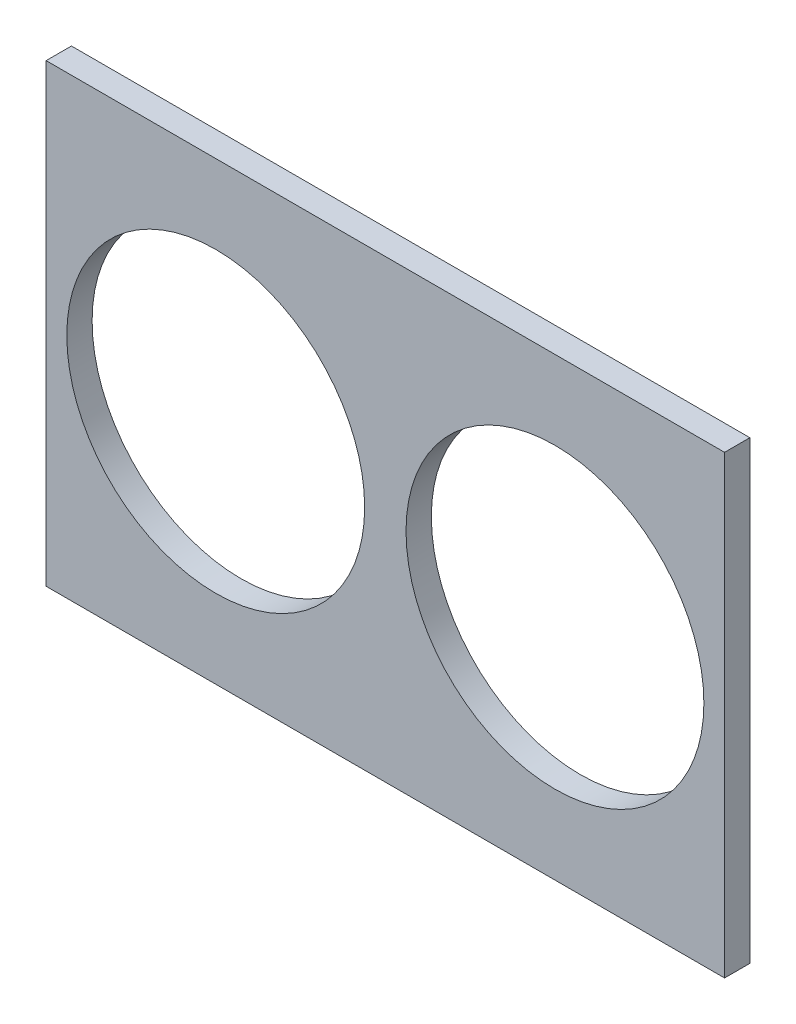
ISO-10303-21;
HEADER;
FILE_DESCRIPTION(('STEP AP214'),'2;1');
FILE_NAME('part.step','',(''),(''),'','','');
FILE_SCHEMA(('AUTOMOTIVE_DESIGN { 1 0 10303 214 1 1 1 1 }'));
ENDSEC;
DATA;
#1=APPLICATION_CONTEXT('core data for automotive mechanical design processes');
#2=APPLICATION_PROTOCOL_DEFINITION('international standard','automotive_design',2000,#1);
#3=PRODUCT_CONTEXT('',#1,'mechanical');
#4=PRODUCT('Part','Part','',(#3));
#5=PRODUCT_RELATED_PRODUCT_CATEGORY('part','',(#4));
#6=PRODUCT_DEFINITION_FORMATION('','',#4);
#7=PRODUCT_DEFINITION_CONTEXT('part definition',#1,'design');
#8=PRODUCT_DEFINITION('design','',#6,#7);
#9=PRODUCT_DEFINITION_SHAPE('','',#8);
#10=(LENGTH_UNIT() NAMED_UNIT(*) SI_UNIT(.MILLI.,.METRE.));
#11=(NAMED_UNIT(*) PLANE_ANGLE_UNIT() SI_UNIT($,.RADIAN.));
#12=(NAMED_UNIT(*) SI_UNIT($,.STERADIAN.) SOLID_ANGLE_UNIT());
#13=UNCERTAINTY_MEASURE_WITH_UNIT(LENGTH_MEASURE(1.E-05),#10,'distance_accuracy_value','');
#14=(GEOMETRIC_REPRESENTATION_CONTEXT(3) GLOBAL_UNCERTAINTY_ASSIGNED_CONTEXT((#13)) GLOBAL_UNIT_ASSIGNED_CONTEXT((#10,
#11,#12)) REPRESENTATION_CONTEXT('',''));
#15=CARTESIAN_POINT('',(0.,0.,0.));
#16=DIRECTION('',(0.,0.,1.));
#17=DIRECTION('',(1.,0.,0.));
#18=AXIS2_PLACEMENT_3D('',#15,#16,#17);
#19=CARTESIAN_POINT('',(0.,0.,-1.41224));
#20=DIRECTION('',(-1.,0.,0.));
#21=DIRECTION('',(0.,0.,1.));
#22=AXIS2_PLACEMENT_3D('',#19,#20,#21);
#23=PLANE('',#22);
#24=DIRECTION('',(0.,-1.,0.));
#25=VECTOR('',#24,1.);
#26=CARTESIAN_POINT('',(0.,0.,0.));
#27=LINE('',#26,#25);
#28=CARTESIAN_POINT('',(0.,0.,0.));
#29=VERTEX_POINT('',#28);
#30=CARTESIAN_POINT('',(0.,-25.4,0.));
#31=VERTEX_POINT('',#30);
#32=EDGE_CURVE('E110',#29,#31,#27,.T.);
#33=ORIENTED_EDGE('',*,*,#32,.F.);
#34=DIRECTION('',(0.,0.,1.));
#35=VECTOR('',#34,1.);
#36=CARTESIAN_POINT('',(0.,0.,-1.41224));
#37=LINE('',#36,#35);
#38=CARTESIAN_POINT('',(0.,0.,-1.41224));
#39=VERTEX_POINT('',#38);
#40=EDGE_CURVE('E11',#39,#29,#37,.T.);
#41=ORIENTED_EDGE('',*,*,#40,.F.);
#42=DIRECTION('',(0.,-1.,0.));
#43=VECTOR('',#42,1.);
#44=CARTESIAN_POINT('',(0.,0.,-1.41224));
#45=LINE('',#44,#43);
#46=CARTESIAN_POINT('',(0.,-25.4,-1.41224));
#47=VERTEX_POINT('',#46);
#48=EDGE_CURVE('E101',#39,#47,#45,.T.);
#49=ORIENTED_EDGE('',*,*,#48,.T.);
#50=DIRECTION('',(0.,0.,1.));
#51=VECTOR('',#50,1.);
#52=CARTESIAN_POINT('',(0.,-25.4,-1.41224));
#53=LINE('',#52,#51);
#54=EDGE_CURVE('E42',#47,#31,#53,.T.);
#55=ORIENTED_EDGE('',*,*,#54,.T.);
#56=EDGE_LOOP('',(#33,#41,#49,#55));
#57=FACE_BOUND('',#56,.T.);
#58=ADVANCED_FACE('F39',(#57),#23,.T.);
#59=CARTESIAN_POINT('',(0.,0.,-1.41224));
#60=DIRECTION('',(0.,1.,0.));
#61=DIRECTION('',(0.,0.,1.));
#62=AXIS2_PLACEMENT_3D('',#59,#60,#61);
#63=PLANE('',#62);
#64=DIRECTION('',(-1.,0.,0.));
#65=VECTOR('',#64,1.);
#66=CARTESIAN_POINT('',(0.,0.,0.));
#67=LINE('',#66,#65);
#68=CARTESIAN_POINT('',(37.85108,0.,0.));
#69=VERTEX_POINT('',#68);
#70=EDGE_CURVE('E104',#69,#29,#67,.T.);
#71=ORIENTED_EDGE('',*,*,#70,.F.);
#72=DIRECTION('',(0.,0.,1.));
#73=VECTOR('',#72,1.);
#74=CARTESIAN_POINT('',(37.85108,0.,-1.41224));
#75=LINE('',#74,#73);
#76=CARTESIAN_POINT('',(37.85108,0.,-1.41224));
#77=VERTEX_POINT('',#76);
#78=EDGE_CURVE('E49',#77,#69,#75,.T.);
#79=ORIENTED_EDGE('',*,*,#78,.F.);
#80=DIRECTION('',(-1.,0.,0.));
#81=VECTOR('',#80,1.);
#82=CARTESIAN_POINT('',(0.,0.,-1.41224));
#83=LINE('',#82,#81);
#84=EDGE_CURVE('E96',#77,#39,#83,.T.);
#85=ORIENTED_EDGE('',*,*,#84,.T.);
#86=ORIENTED_EDGE('',*,*,#40,.T.);
#87=EDGE_LOOP('',(#71,#79,#85,#86));
#88=FACE_BOUND('',#87,.T.);
#89=ADVANCED_FACE('F127',(#88),#63,.T.);
#90=CARTESIAN_POINT('',(37.85108,0.,-1.41224));
#91=DIRECTION('',(1.,0.,0.));
#92=DIRECTION('',(0.,0.,-1.));
#93=AXIS2_PLACEMENT_3D('',#90,#91,#92);
#94=PLANE('',#93);
#95=DIRECTION('',(0.,1.,0.));
#96=VECTOR('',#95,1.);
#97=CARTESIAN_POINT('',(37.85108,0.,0.));
#98=LINE('',#97,#96);
#99=CARTESIAN_POINT('',(37.85108,-25.4,0.));
#100=VERTEX_POINT('',#99);
#101=EDGE_CURVE('E90',#100,#69,#98,.T.);
#102=ORIENTED_EDGE('',*,*,#101,.F.);
#103=DIRECTION('',(0.,0.,1.));
#104=VECTOR('',#103,1.);
#105=CARTESIAN_POINT('',(37.85108,-25.4,-1.41224));
#106=LINE('',#105,#104);
#107=CARTESIAN_POINT('',(37.85108,-25.4,-1.41224));
#108=VERTEX_POINT('',#107);
#109=EDGE_CURVE('E85',#108,#100,#106,.T.);
#110=ORIENTED_EDGE('',*,*,#109,.F.);
#111=DIRECTION('',(0.,1.,0.));
#112=VECTOR('',#111,1.);
#113=CARTESIAN_POINT('',(37.85108,0.,-1.41224));
#114=LINE('',#113,#112);
#115=EDGE_CURVE('E88',#108,#77,#114,.T.);
#116=ORIENTED_EDGE('',*,*,#115,.T.);
#117=ORIENTED_EDGE('',*,*,#78,.T.);
#118=EDGE_LOOP('',(#102,#110,#116,#117));
#119=FACE_BOUND('',#118,.T.);
#120=ADVANCED_FACE('F87',(#119),#94,.T.);
#121=CARTESIAN_POINT('',(0.,-25.4,-1.41224));
#122=DIRECTION('',(0.,-1.,0.));
#123=DIRECTION('',(0.,0.,-1.));
#124=AXIS2_PLACEMENT_3D('',#121,#122,#123);
#125=PLANE('',#124);
#126=DIRECTION('',(1.,0.,0.));
#127=VECTOR('',#126,1.);
#128=CARTESIAN_POINT('',(0.,-25.4,0.));
#129=LINE('',#128,#127);
#130=EDGE_CURVE('E114',#31,#100,#129,.T.);
#131=ORIENTED_EDGE('',*,*,#130,.F.);
#132=ORIENTED_EDGE('',*,*,#54,.F.);
#133=DIRECTION('',(1.,0.,0.));
#134=VECTOR('',#133,1.);
#135=CARTESIAN_POINT('',(0.,-25.4,-1.41224));
#136=LINE('',#135,#134);
#137=EDGE_CURVE('E95',#47,#108,#136,.T.);
#138=ORIENTED_EDGE('',*,*,#137,.T.);
#139=ORIENTED_EDGE('',*,*,#109,.T.);
#140=EDGE_LOOP('',(#131,#132,#138,#139));
#141=FACE_BOUND('',#140,.T.);
#142=ADVANCED_FACE('F99',(#141),#125,.T.);
#143=CARTESIAN_POINT('',(0.,0.,-1.41224));
#144=DIRECTION('',(0.,0.,1.));
#145=DIRECTION('',(1.,0.,0.));
#146=AXIS2_PLACEMENT_3D('',#143,#144,#145);
#147=PLANE('',#146);
#148=CARTESIAN_POINT('',(28.38831,-12.7,-1.41224));
#149=DIRECTION('',(0.,0.,1.));
#150=DIRECTION('',(-1.,0.,0.));
#151=AXIS2_PLACEMENT_3D('',#148,#149,#150);
#152=CIRCLE('',#151,8.30904590534919);
#153=CARTESIAN_POINT('',(20.0792640946508,-12.7,-1.41224));
#154=VERTEX_POINT('',#153);
#155=EDGE_CURVE('E160',#154,#154,#152,.T.);
#156=ORIENTED_EDGE('',*,*,#155,.T.);
#157=EDGE_LOOP('',(#156));
#158=FACE_BOUND('',#157,.T.);
#159=CARTESIAN_POINT('',(9.46277,-12.7,-1.41224));
#160=DIRECTION('',(0.,0.,1.));
#161=DIRECTION('',(1.,0.,0.));
#162=AXIS2_PLACEMENT_3D('',#159,#160,#161);
#163=CIRCLE('',#162,8.30904590534919);
#164=CARTESIAN_POINT('',(17.7718159053492,-12.7,-1.41224));
#165=VERTEX_POINT('',#164);
#166=EDGE_CURVE('E115',#165,#165,#163,.T.);
#167=ORIENTED_EDGE('',*,*,#166,.T.);
#168=EDGE_LOOP('',(#167));
#169=FACE_BOUND('',#168,.T.);
#170=ORIENTED_EDGE('',*,*,#48,.F.);
#171=ORIENTED_EDGE('',*,*,#84,.F.);
#172=ORIENTED_EDGE('',*,*,#115,.F.);
#173=ORIENTED_EDGE('',*,*,#137,.F.);
#174=EDGE_LOOP('',(#170,#171,#172,#173));
#175=FACE_BOUND('',#174,.T.);
#176=ADVANCED_FACE('F94',(#158,#169,#175),#147,.F.);
#177=CARTESIAN_POINT('',(0.,0.,0.));
#178=DIRECTION('',(0.,0.,1.));
#179=DIRECTION('',(1.,0.,0.));
#180=AXIS2_PLACEMENT_3D('',#177,#178,#179);
#181=PLANE('',#180);
#182=CARTESIAN_POINT('',(28.38831,-12.7,0.));
#183=DIRECTION('',(0.,0.,1.));
#184=DIRECTION('',(-1.,0.,0.));
#185=AXIS2_PLACEMENT_3D('',#182,#183,#184);
#186=CIRCLE('',#185,8.30904590534919);
#187=CARTESIAN_POINT('',(20.0792640946508,-12.7,0.));
#188=VERTEX_POINT('',#187);
#189=EDGE_CURVE('E163',#188,#188,#186,.T.);
#190=ORIENTED_EDGE('',*,*,#189,.F.);
#191=EDGE_LOOP('',(#190));
#192=FACE_BOUND('',#191,.T.);
#193=CARTESIAN_POINT('',(9.46277,-12.7,0.));
#194=DIRECTION('',(0.,0.,1.));
#195=DIRECTION('',(1.,0.,0.));
#196=AXIS2_PLACEMENT_3D('',#193,#194,#195);
#197=CIRCLE('',#196,8.30904590534919);
#198=CARTESIAN_POINT('',(17.7718159053492,-12.7,0.));
#199=VERTEX_POINT('',#198);
#200=EDGE_CURVE('E167',#199,#199,#197,.T.);
#201=ORIENTED_EDGE('',*,*,#200,.F.);
#202=EDGE_LOOP('',(#201));
#203=FACE_BOUND('',#202,.T.);
#204=ORIENTED_EDGE('',*,*,#32,.T.);
#205=ORIENTED_EDGE('',*,*,#130,.T.);
#206=ORIENTED_EDGE('',*,*,#101,.T.);
#207=ORIENTED_EDGE('',*,*,#70,.T.);
#208=EDGE_LOOP('',(#204,#205,#206,#207));
#209=FACE_BOUND('',#208,.T.);
#210=ADVANCED_FACE('F126',(#192,#203,#209),#181,.T.);
#211=CARTESIAN_POINT('',(9.46277,-12.7,-1.41224));
#212=DIRECTION('',(0.,0.,1.));
#213=DIRECTION('',(1.,0.,0.));
#214=AXIS2_PLACEMENT_3D('',#211,#212,#213);
#215=CYLINDRICAL_SURFACE('',#214,8.30904590534919);
#216=ORIENTED_EDGE('',*,*,#166,.F.);
#217=EDGE_LOOP('',(#216));
#218=FACE_BOUND('',#217,.T.);
#219=ORIENTED_EDGE('',*,*,#200,.T.);
#220=EDGE_LOOP('',(#219));
#221=FACE_BOUND('',#220,.T.);
#222=ADVANCED_FACE('F145',(#218,#221),#215,.F.);
#223=CARTESIAN_POINT('',(28.38831,-12.7,-1.41224));
#224=DIRECTION('',(0.,0.,1.));
#225=DIRECTION('',(1.,0.,0.));
#226=AXIS2_PLACEMENT_3D('',#223,#224,#225);
#227=CYLINDRICAL_SURFACE('',#226,8.30904590534919);
#228=ORIENTED_EDGE('',*,*,#155,.F.);
#229=EDGE_LOOP('',(#228));
#230=FACE_BOUND('',#229,.T.);
#231=ORIENTED_EDGE('',*,*,#189,.T.);
#232=EDGE_LOOP('',(#231));
#233=FACE_BOUND('',#232,.T.);
#234=ADVANCED_FACE('F152',(#230,#233),#227,.F.);
#235=CLOSED_SHELL('',(#58,#89,#120,#142,#176,#210,#222,#234));
#236=MANIFOLD_SOLID_BREP('B2',#235);
#237=ADVANCED_BREP_SHAPE_REPRESENTATION('',(#18,#236),#14);
#238=SHAPE_DEFINITION_REPRESENTATION(#9,#237);
ENDSEC;
END-ISO-10303-21;
